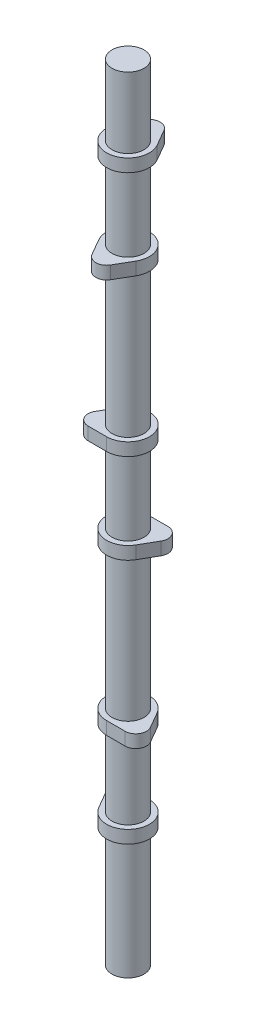
ISO-10303-21;
HEADER;
FILE_DESCRIPTION(('STEP AP214'),'2;1');
FILE_NAME('part.step','',(''),(''),'','','');
FILE_SCHEMA(('AUTOMOTIVE_DESIGN { 1 0 10303 214 1 1 1 1 }'));
ENDSEC;
DATA;
#1=APPLICATION_CONTEXT('core data for automotive mechanical design processes');
#2=APPLICATION_PROTOCOL_DEFINITION('international standard','automotive_design',2000,#1);
#3=PRODUCT_CONTEXT('',#1,'mechanical');
#4=PRODUCT('Part','Part','',(#3));
#5=PRODUCT_RELATED_PRODUCT_CATEGORY('part','',(#4));
#6=PRODUCT_DEFINITION_FORMATION('','',#4);
#7=PRODUCT_DEFINITION_CONTEXT('part definition',#1,'design');
#8=PRODUCT_DEFINITION('design','',#6,#7);
#9=PRODUCT_DEFINITION_SHAPE('','',#8);
#10=(LENGTH_UNIT() NAMED_UNIT(*) SI_UNIT(.MILLI.,.METRE.));
#11=(NAMED_UNIT(*) PLANE_ANGLE_UNIT() SI_UNIT($,.RADIAN.));
#12=(NAMED_UNIT(*) SI_UNIT($,.STERADIAN.) SOLID_ANGLE_UNIT());
#13=UNCERTAINTY_MEASURE_WITH_UNIT(LENGTH_MEASURE(1.E-05),#10,'distance_accuracy_value','');
#14=(GEOMETRIC_REPRESENTATION_CONTEXT(3) GLOBAL_UNCERTAINTY_ASSIGNED_CONTEXT((#13)) GLOBAL_UNIT_ASSIGNED_CONTEXT((#10,
#11,#12)) REPRESENTATION_CONTEXT('',''));
#15=CARTESIAN_POINT('',(0.,0.,0.));
#16=DIRECTION('',(0.,0.,1.));
#17=DIRECTION('',(1.,0.,0.));
#18=AXIS2_PLACEMENT_3D('',#15,#16,#17);
#19=CARTESIAN_POINT('',(-10.9985226280623,-138.43,6.35000000000005));
#20=DIRECTION('',(0.,-1.,0.));
#21=DIRECTION('',(-0.866025403784436,0.,0.500000000000004));
#22=AXIS2_PLACEMENT_3D('',#19,#20,#21);
#23=CYLINDRICAL_SURFACE('',#22,6.35);
#24=CARTESIAN_POINT('',(-10.9985226280623,-146.05,6.35000000000005));
#25=DIRECTION('',(0.,1.,0.));
#26=DIRECTION('',(0.866025403784436,0.,-0.500000000000004));
#27=AXIS2_PLACEMENT_3D('',#24,#25,#26);
#28=CIRCLE('',#27,6.35);
#29=CARTESIAN_POINT('',(-16.4977839420935,-146.05,3.17500000000008));
#30=VERTEX_POINT('',#29);
#31=CARTESIAN_POINT('',(-10.9985226280623,-146.05,12.7000000000001));
#32=VERTEX_POINT('',#31);
#33=EDGE_CURVE('E327',#30,#32,#28,.T.);
#34=ORIENTED_EDGE('',*,*,#33,.T.);
#35=DIRECTION('',(0.,-1.,0.));
#36=VECTOR('',#35,1.);
#37=CARTESIAN_POINT('',(-10.9985226280623,-138.43,12.7000000000001));
#38=LINE('',#37,#36);
#39=CARTESIAN_POINT('',(-10.9985226280623,-138.43,12.7000000000001));
#40=VERTEX_POINT('',#39);
#41=EDGE_CURVE('E315',#40,#32,#38,.T.);
#42=ORIENTED_EDGE('',*,*,#41,.F.);
#43=CARTESIAN_POINT('',(-10.9985226280623,-138.43,6.35000000000005));
#44=DIRECTION('',(0.,1.,0.));
#45=DIRECTION('',(0.866025403784436,0.,-0.500000000000004));
#46=AXIS2_PLACEMENT_3D('',#43,#44,#45);
#47=CIRCLE('',#46,6.35);
#48=CARTESIAN_POINT('',(-16.4977839420935,-138.43,3.17500000000008));
#49=VERTEX_POINT('',#48);
#50=EDGE_CURVE('E316',#49,#40,#47,.T.);
#51=ORIENTED_EDGE('',*,*,#50,.F.);
#52=DIRECTION('',(0.,-1.,0.));
#53=VECTOR('',#52,1.);
#54=CARTESIAN_POINT('',(-16.4977839420935,-138.43,3.17500000000008));
#55=LINE('',#54,#53);
#56=EDGE_CURVE('E326',#49,#30,#55,.T.);
#57=ORIENTED_EDGE('',*,*,#56,.T.);
#58=EDGE_LOOP('',(#34,#42,#51,#57));
#59=FACE_BOUND('',#58,.T.);
#60=ADVANCED_FACE('F54',(#59),#23,.T.);
#61=CARTESIAN_POINT('',(-10.9985226280623,-138.43,12.7000000000001));
#62=DIRECTION('',(0.,0.,-1.));
#63=DIRECTION('',(-1.,0.,0.));
#64=AXIS2_PLACEMENT_3D('',#61,#62,#63);
#65=PLANE('',#64);
#66=DIRECTION('',(1.,0.,0.));
#67=VECTOR('',#66,1.);
#68=CARTESIAN_POINT('',(-10.9985226280623,-146.05,12.7000000000001));
#69=LINE('',#68,#67);
#70=CARTESIAN_POINT('',(0.,-146.05,12.7));
#71=VERTEX_POINT('',#70);
#72=EDGE_CURVE('E331',#32,#71,#69,.T.);
#73=ORIENTED_EDGE('',*,*,#72,.T.);
#74=DIRECTION('',(0.,-1.,0.));
#75=VECTOR('',#74,1.);
#76=CARTESIAN_POINT('',(0.,-138.43,12.7));
#77=LINE('',#76,#75);
#78=CARTESIAN_POINT('',(0.,-138.43,12.7));
#79=VERTEX_POINT('',#78);
#80=EDGE_CURVE('E343',#79,#71,#77,.T.);
#81=ORIENTED_EDGE('',*,*,#80,.F.);
#82=DIRECTION('',(1.,0.,0.));
#83=VECTOR('',#82,1.);
#84=CARTESIAN_POINT('',(-10.9985226280623,-138.43,12.7000000000001));
#85=LINE('',#84,#83);
#86=EDGE_CURVE('E103',#40,#79,#85,.T.);
#87=ORIENTED_EDGE('',*,*,#86,.F.);
#88=ORIENTED_EDGE('',*,*,#41,.T.);
#89=EDGE_LOOP('',(#73,#81,#87,#88));
#90=FACE_BOUND('',#89,.T.);
#91=ADVANCED_FACE('F415',(#90),#65,.F.);
#92=CARTESIAN_POINT('',(0.,-138.43,0.));
#93=DIRECTION('',(0.,-1.,0.));
#94=DIRECTION('',(-0.866025403784436,0.,0.500000000000004));
#95=AXIS2_PLACEMENT_3D('',#92,#93,#94);
#96=CYLINDRICAL_SURFACE('',#95,12.7);
#97=CARTESIAN_POINT('',(0.,-146.05,0.));
#98=DIRECTION('',(0.,1.,0.));
#99=DIRECTION('',(0.866025403784436,0.,-0.500000000000004));
#100=AXIS2_PLACEMENT_3D('',#97,#98,#99);
#101=CIRCLE('',#100,12.7);
#102=CARTESIAN_POINT('',(-10.9985226280624,-146.05,-6.34999999999995));
#103=VERTEX_POINT('',#102);
#104=EDGE_CURVE('E89',#71,#103,#101,.T.);
#105=ORIENTED_EDGE('',*,*,#104,.T.);
#106=DIRECTION('',(0.,-1.,0.));
#107=VECTOR('',#106,1.);
#108=CARTESIAN_POINT('',(-10.9985226280624,-138.43,-6.34999999999995));
#109=LINE('',#108,#107);
#110=CARTESIAN_POINT('',(-10.9985226280624,-138.43,-6.34999999999995));
#111=VERTEX_POINT('',#110);
#112=EDGE_CURVE('E340',#111,#103,#109,.T.);
#113=ORIENTED_EDGE('',*,*,#112,.F.);
#114=CARTESIAN_POINT('',(0.,-138.43,0.));
#115=DIRECTION('',(0.,1.,0.));
#116=DIRECTION('',(0.866025403784436,0.,-0.500000000000004));
#117=AXIS2_PLACEMENT_3D('',#114,#115,#116);
#118=CIRCLE('',#117,12.7);
#119=EDGE_CURVE('E321',#79,#111,#118,.T.);
#120=ORIENTED_EDGE('',*,*,#119,.F.);
#121=ORIENTED_EDGE('',*,*,#80,.T.);
#122=EDGE_LOOP('',(#105,#113,#120,#121));
#123=FACE_BOUND('',#122,.T.);
#124=ADVANCED_FACE('F420',(#123),#96,.T.);
#125=CARTESIAN_POINT('',(-16.4977839420935,-138.43,3.17500000000008));
#126=DIRECTION('',(0.866025403784441,0.,0.499999999999996));
#127=DIRECTION('',(0.499999999999996,0.,-0.866025403784441));
#128=AXIS2_PLACEMENT_3D('',#125,#126,#127);
#129=PLANE('',#128);
#130=DIRECTION('',(-0.499999999999996,0.,0.866025403784441));
#131=VECTOR('',#130,1.);
#132=CARTESIAN_POINT('',(-16.4977839420935,-146.05,3.17500000000008));
#133=LINE('',#132,#131);
#134=EDGE_CURVE('E95',#103,#30,#133,.T.);
#135=ORIENTED_EDGE('',*,*,#134,.T.);
#136=ORIENTED_EDGE('',*,*,#56,.F.);
#137=DIRECTION('',(-0.499999999999996,0.,0.866025403784441));
#138=VECTOR('',#137,1.);
#139=CARTESIAN_POINT('',(-16.4977839420935,-138.43,3.17500000000008));
#140=LINE('',#139,#138);
#141=EDGE_CURVE('E71',#111,#49,#140,.T.);
#142=ORIENTED_EDGE('',*,*,#141,.F.);
#143=ORIENTED_EDGE('',*,*,#112,.T.);
#144=EDGE_LOOP('',(#135,#136,#142,#143));
#145=FACE_BOUND('',#144,.T.);
#146=ADVANCED_FACE('F429',(#145),#129,.F.);
#147=CARTESIAN_POINT('',(-10.9985226280623,-138.43,6.35000000000005));
#148=DIRECTION('',(0.,1.,0.));
#149=DIRECTION('',(0.866025403784436,0.,-0.500000000000004));
#150=AXIS2_PLACEMENT_3D('',#147,#148,#149);
#151=PLANE('',#150);
#152=CARTESIAN_POINT('',(0.,-138.43,0.));
#153=DIRECTION('',(0.,1.,0.));
#154=DIRECTION('',(0.,0.,1.));
#155=AXIS2_PLACEMENT_3D('',#152,#153,#154);
#156=CIRCLE('',#155,9.5);
#157=CARTESIAN_POINT('',(0.,-138.43,9.5));
#158=VERTEX_POINT('',#157);
#159=EDGE_CURVE('E310',#158,#158,#156,.T.);
#160=ORIENTED_EDGE('',*,*,#159,.F.);
#161=EDGE_LOOP('',(#160));
#162=FACE_BOUND('',#161,.T.);
#163=ORIENTED_EDGE('',*,*,#50,.T.);
#164=ORIENTED_EDGE('',*,*,#86,.T.);
#165=ORIENTED_EDGE('',*,*,#119,.T.);
#166=ORIENTED_EDGE('',*,*,#141,.T.);
#167=EDGE_LOOP('',(#163,#164,#165,#166));
#168=FACE_BOUND('',#167,.T.);
#169=ADVANCED_FACE('F427',(#162,#168),#151,.T.);
#170=CARTESIAN_POINT('',(-10.9985226280623,-146.05,6.35000000000005));
#171=DIRECTION('',(0.,1.,0.));
#172=DIRECTION('',(0.866025403784436,0.,-0.500000000000004));
#173=AXIS2_PLACEMENT_3D('',#170,#171,#172);
#174=PLANE('',#173);
#175=CARTESIAN_POINT('',(0.,-146.05,0.));
#176=DIRECTION('',(0.,1.,0.));
#177=DIRECTION('',(0.,0.,1.));
#178=AXIS2_PLACEMENT_3D('',#175,#176,#177);
#179=CIRCLE('',#178,9.5);
#180=CARTESIAN_POINT('',(0.,-146.05,9.5));
#181=VERTEX_POINT('',#180);
#182=EDGE_CURVE('E305',#181,#181,#179,.T.);
#183=ORIENTED_EDGE('',*,*,#182,.T.);
#184=EDGE_LOOP('',(#183));
#185=FACE_BOUND('',#184,.T.);
#186=ORIENTED_EDGE('',*,*,#33,.F.);
#187=ORIENTED_EDGE('',*,*,#134,.F.);
#188=ORIENTED_EDGE('',*,*,#104,.F.);
#189=ORIENTED_EDGE('',*,*,#72,.F.);
#190=EDGE_LOOP('',(#186,#187,#188,#189));
#191=FACE_BOUND('',#190,.T.);
#192=ADVANCED_FACE('F425',(#185,#191),#174,.F.);
#193=CARTESIAN_POINT('',(0.,-416.56,0.));
#194=DIRECTION('',(0.,1.,0.));
#195=DIRECTION('',(0.,0.,1.));
#196=AXIS2_PLACEMENT_3D('',#193,#194,#195);
#197=CYLINDRICAL_SURFACE('',#196,9.5);
#198=CARTESIAN_POINT('',(0.,-191.77,0.));
#199=DIRECTION('',(0.,1.,0.));
#200=DIRECTION('',(0.,0.,1.));
#201=AXIS2_PLACEMENT_3D('',#198,#199,#200);
#202=CIRCLE('',#201,9.5);
#203=CARTESIAN_POINT('',(0.,-191.77,9.5));
#204=VERTEX_POINT('',#203);
#205=EDGE_CURVE('E314',#204,#204,#202,.F.);
#206=ORIENTED_EDGE('',*,*,#205,.F.);
#207=EDGE_LOOP('',(#206));
#208=FACE_BOUND('',#207,.T.);
#209=ORIENTED_EDGE('',*,*,#182,.F.);
#210=EDGE_LOOP('',(#209));
#211=FACE_BOUND('',#210,.T.);
#212=ADVANCED_FACE('F436',(#208,#211),#197,.T.);
#213=ORIENTED_EDGE('',*,*,#159,.T.);
#214=EDGE_LOOP('',(#213));
#215=FACE_BOUND('',#214,.T.);
#216=CARTESIAN_POINT('',(0.,49.53,0.));
#217=DIRECTION('',(0.,1.,0.));
#218=DIRECTION('',(0.,0.,1.));
#219=AXIS2_PLACEMENT_3D('',#216,#217,#218);
#220=CIRCLE('',#219,9.5);
#221=CARTESIAN_POINT('',(0.,49.53,9.5));
#222=VERTEX_POINT('',#221);
#223=EDGE_CURVE('E306',#222,#222,#220,.T.);
#224=ORIENTED_EDGE('',*,*,#223,.F.);
#225=EDGE_LOOP('',(#224));
#226=FACE_BOUND('',#225,.T.);
#227=ADVANCED_FACE('F372',(#215,#226),#197,.T.);
#228=CARTESIAN_POINT('',(0.,49.53,0.));
#229=DIRECTION('',(0.,1.,0.));
#230=DIRECTION('',(0.,0.,1.));
#231=AXIS2_PLACEMENT_3D('',#228,#229,#230);
#232=PLANE('',#231);
#233=ORIENTED_EDGE('',*,*,#223,.T.);
#234=EDGE_LOOP('',(#233));
#235=FACE_BOUND('',#234,.T.);
#236=ADVANCED_FACE('F483',(#235),#232,.T.);
#237=CARTESIAN_POINT('',(10.9985226280624,-191.77,-6.34999999999997));
#238=DIRECTION('',(0.,-1.,0.));
#239=DIRECTION('',(0.86602540378444,0.,-0.499999999999998));
#240=AXIS2_PLACEMENT_3D('',#237,#238,#239);
#241=CYLINDRICAL_SURFACE('',#240,6.35);
#242=CARTESIAN_POINT('',(10.9985226280624,-199.39,-6.34999999999997));
#243=DIRECTION('',(0.,1.,0.));
#244=DIRECTION('',(-0.86602540378444,0.,0.499999999999998));
#245=AXIS2_PLACEMENT_3D('',#242,#243,#244);
#246=CIRCLE('',#245,6.35);
#247=CARTESIAN_POINT('',(16.4977839420936,-199.39,-3.17499999999996));
#248=VERTEX_POINT('',#247);
#249=CARTESIAN_POINT('',(10.9985226280624,-199.39,-12.7));
#250=VERTEX_POINT('',#249);
#251=EDGE_CURVE('E273',#248,#250,#246,.T.);
#252=ORIENTED_EDGE('',*,*,#251,.T.);
#253=DIRECTION('',(0.,-1.,0.));
#254=VECTOR('',#253,1.);
#255=CARTESIAN_POINT('',(10.9985226280624,-191.77,-12.7));
#256=LINE('',#255,#254);
#257=CARTESIAN_POINT('',(10.9985226280624,-191.77,-12.7));
#258=VERTEX_POINT('',#257);
#259=EDGE_CURVE('E296',#258,#250,#256,.T.);
#260=ORIENTED_EDGE('',*,*,#259,.F.);
#261=CARTESIAN_POINT('',(10.9985226280624,-191.77,-6.34999999999997));
#262=DIRECTION('',(0.,1.,0.));
#263=DIRECTION('',(-0.86602540378444,0.,0.499999999999998));
#264=AXIS2_PLACEMENT_3D('',#261,#262,#263);
#265=CIRCLE('',#264,6.35);
#266=CARTESIAN_POINT('',(16.4977839420936,-191.77,-3.17499999999996));
#267=VERTEX_POINT('',#266);
#268=EDGE_CURVE('E258',#267,#258,#265,.T.);
#269=ORIENTED_EDGE('',*,*,#268,.F.);
#270=DIRECTION('',(0.,-1.,0.));
#271=VECTOR('',#270,1.);
#272=CARTESIAN_POINT('',(16.4977839420936,-191.77,-3.17499999999996));
#273=LINE('',#272,#271);
#274=EDGE_CURVE('E272',#267,#248,#273,.T.);
#275=ORIENTED_EDGE('',*,*,#274,.T.);
#276=EDGE_LOOP('',(#252,#260,#269,#275));
#277=FACE_BOUND('',#276,.T.);
#278=ADVANCED_FACE('F493',(#277),#241,.T.);
#279=CARTESIAN_POINT('',(10.9985226280624,-191.77,-12.7));
#280=DIRECTION('',(0.,0.,1.));
#281=DIRECTION('',(1.,0.,0.));
#282=AXIS2_PLACEMENT_3D('',#279,#280,#281);
#283=PLANE('',#282);
#284=DIRECTION('',(-1.,0.,0.));
#285=VECTOR('',#284,1.);
#286=CARTESIAN_POINT('',(10.9985226280624,-199.39,-12.7));
#287=LINE('',#286,#285);
#288=CARTESIAN_POINT('',(0.,-199.39,-12.7));
#289=VERTEX_POINT('',#288);
#290=EDGE_CURVE('E277',#250,#289,#287,.T.);
#291=ORIENTED_EDGE('',*,*,#290,.T.);
#292=DIRECTION('',(0.,-1.,0.));
#293=VECTOR('',#292,1.);
#294=CARTESIAN_POINT('',(0.,-191.77,-12.7));
#295=LINE('',#294,#293);
#296=CARTESIAN_POINT('',(0.,-191.77,-12.7));
#297=VERTEX_POINT('',#296);
#298=EDGE_CURVE('E292',#297,#289,#295,.T.);
#299=ORIENTED_EDGE('',*,*,#298,.F.);
#300=DIRECTION('',(-1.,0.,0.));
#301=VECTOR('',#300,1.);
#302=CARTESIAN_POINT('',(10.9985226280624,-191.77,-12.7));
#303=LINE('',#302,#301);
#304=EDGE_CURVE('E262',#258,#297,#303,.T.);
#305=ORIENTED_EDGE('',*,*,#304,.F.);
#306=ORIENTED_EDGE('',*,*,#259,.T.);
#307=EDGE_LOOP('',(#291,#299,#305,#306));
#308=FACE_BOUND('',#307,.T.);
#309=ADVANCED_FACE('F504',(#308),#283,.F.);
#310=CARTESIAN_POINT('',(0.,-191.77,0.));
#311=DIRECTION('',(0.,-1.,0.));
#312=DIRECTION('',(0.86602540378444,0.,-0.499999999999998));
#313=AXIS2_PLACEMENT_3D('',#310,#311,#312);
#314=CYLINDRICAL_SURFACE('',#313,12.7);
#315=CARTESIAN_POINT('',(0.,-199.39,0.));
#316=DIRECTION('',(0.,1.,0.));
#317=DIRECTION('',(-0.86602540378444,0.,0.499999999999998));
#318=AXIS2_PLACEMENT_3D('',#315,#316,#317);
#319=CIRCLE('',#318,12.7);
#320=CARTESIAN_POINT('',(10.9985226280624,-199.39,6.35000000000003));
#321=VERTEX_POINT('',#320);
#322=EDGE_CURVE('E280',#289,#321,#319,.T.);
#323=ORIENTED_EDGE('',*,*,#322,.T.);
#324=DIRECTION('',(0.,-1.,0.));
#325=VECTOR('',#324,1.);
#326=CARTESIAN_POINT('',(10.9985226280624,-191.77,6.35000000000003));
#327=LINE('',#326,#325);
#328=CARTESIAN_POINT('',(10.9985226280624,-191.77,6.35000000000003));
#329=VERTEX_POINT('',#328);
#330=EDGE_CURVE('E288',#329,#321,#327,.T.);
#331=ORIENTED_EDGE('',*,*,#330,.F.);
#332=CARTESIAN_POINT('',(0.,-191.77,0.));
#333=DIRECTION('',(0.,1.,0.));
#334=DIRECTION('',(-0.86602540378444,0.,0.499999999999998));
#335=AXIS2_PLACEMENT_3D('',#332,#333,#334);
#336=CIRCLE('',#335,12.7);
#337=EDGE_CURVE('E266',#297,#329,#336,.T.);
#338=ORIENTED_EDGE('',*,*,#337,.F.);
#339=ORIENTED_EDGE('',*,*,#298,.T.);
#340=EDGE_LOOP('',(#323,#331,#338,#339));
#341=FACE_BOUND('',#340,.T.);
#342=ADVANCED_FACE('F514',(#341),#314,.T.);
#343=CARTESIAN_POINT('',(16.4977839420936,-191.77,-3.17499999999996));
#344=DIRECTION('',(-0.866025403784438,0.,-0.500000000000002));
#345=DIRECTION('',(-0.500000000000002,0.,0.866025403784438));
#346=AXIS2_PLACEMENT_3D('',#343,#344,#345);
#347=PLANE('',#346);
#348=DIRECTION('',(0.500000000000002,0.,-0.866025403784438));
#349=VECTOR('',#348,1.);
#350=CARTESIAN_POINT('',(16.4977839420936,-199.39,-3.17499999999996));
#351=LINE('',#350,#349);
#352=EDGE_CURVE('E263',#321,#248,#351,.T.);
#353=ORIENTED_EDGE('',*,*,#352,.T.);
#354=ORIENTED_EDGE('',*,*,#274,.F.);
#355=DIRECTION('',(0.500000000000002,0.,-0.866025403784438));
#356=VECTOR('',#355,1.);
#357=CARTESIAN_POINT('',(16.4977839420936,-191.77,-3.17499999999996));
#358=LINE('',#357,#356);
#359=EDGE_CURVE('E269',#329,#267,#358,.T.);
#360=ORIENTED_EDGE('',*,*,#359,.F.);
#361=ORIENTED_EDGE('',*,*,#330,.T.);
#362=EDGE_LOOP('',(#353,#354,#360,#361));
#363=FACE_BOUND('',#362,.T.);
#364=ADVANCED_FACE('F525',(#363),#347,.F.);
#365=CARTESIAN_POINT('',(10.9985226280624,-191.77,-6.34999999999997));
#366=DIRECTION('',(0.,1.,0.));
#367=DIRECTION('',(-0.86602540378444,0.,0.499999999999998));
#368=AXIS2_PLACEMENT_3D('',#365,#366,#367);
#369=PLANE('',#368);
#370=ORIENTED_EDGE('',*,*,#205,.T.);
#371=EDGE_LOOP('',(#370));
#372=FACE_BOUND('',#371,.T.);
#373=ORIENTED_EDGE('',*,*,#268,.T.);
#374=ORIENTED_EDGE('',*,*,#304,.T.);
#375=ORIENTED_EDGE('',*,*,#337,.T.);
#376=ORIENTED_EDGE('',*,*,#359,.T.);
#377=EDGE_LOOP('',(#373,#374,#375,#376));
#378=FACE_BOUND('',#377,.T.);
#379=ADVANCED_FACE('F536',(#372,#378),#369,.T.);
#380=CARTESIAN_POINT('',(10.9985226280624,-199.39,-6.34999999999997));
#381=DIRECTION('',(0.,1.,0.));
#382=DIRECTION('',(-0.86602540378444,0.,0.499999999999998));
#383=AXIS2_PLACEMENT_3D('',#380,#381,#382);
#384=PLANE('',#383);
#385=CARTESIAN_POINT('',(0.,-199.39,0.));
#386=DIRECTION('',(0.,1.,0.));
#387=DIRECTION('',(0.,0.,1.));
#388=AXIS2_PLACEMENT_3D('',#385,#386,#387);
#389=CIRCLE('',#388,9.5);
#390=CARTESIAN_POINT('',(0.,-199.39,9.5));
#391=VERTEX_POINT('',#390);
#392=EDGE_CURVE('E300',#391,#391,#389,.F.);
#393=ORIENTED_EDGE('',*,*,#392,.F.);
#394=EDGE_LOOP('',(#393));
#395=FACE_BOUND('',#394,.T.);
#396=ORIENTED_EDGE('',*,*,#251,.F.);
#397=ORIENTED_EDGE('',*,*,#352,.F.);
#398=ORIENTED_EDGE('',*,*,#322,.F.);
#399=ORIENTED_EDGE('',*,*,#290,.F.);
#400=EDGE_LOOP('',(#396,#397,#398,#399));
#401=FACE_BOUND('',#400,.T.);
#402=ADVANCED_FACE('F547',(#395,#401),#384,.F.);
#403=CARTESIAN_POINT('',(0.,-284.48,0.));
#404=DIRECTION('',(0.,1.,0.));
#405=DIRECTION('',(0.,0.,1.));
#406=AXIS2_PLACEMENT_3D('',#403,#404,#405);
#407=CIRCLE('',#406,9.5);
#408=CARTESIAN_POINT('',(0.,-284.48,9.5));
#409=VERTEX_POINT('',#408);
#410=EDGE_CURVE('E12',#409,#409,#407,.F.);
#411=ORIENTED_EDGE('',*,*,#410,.F.);
#412=EDGE_LOOP('',(#411));
#413=FACE_BOUND('',#412,.T.);
#414=ORIENTED_EDGE('',*,*,#392,.T.);
#415=EDGE_LOOP('',(#414));
#416=FACE_BOUND('',#415,.T.);
#417=ADVANCED_FACE('F473',(#413,#416),#197,.T.);
#418=CARTESIAN_POINT('',(10.9985226280624,-284.48,6.3499999999999));
#419=DIRECTION('',(0.,-1.,0.));
#420=DIRECTION('',(0.866025403784443,0.,0.499999999999992));
#421=AXIS2_PLACEMENT_3D('',#418,#419,#420);
#422=CYLINDRICAL_SURFACE('',#421,6.35);
#423=CARTESIAN_POINT('',(10.9985226280624,-292.1,6.3499999999999));
#424=DIRECTION('',(0.,1.,0.));
#425=DIRECTION('',(-0.866025403784443,0.,-0.499999999999992));
#426=AXIS2_PLACEMENT_3D('',#423,#424,#425);
#427=CIRCLE('',#426,6.35);
#428=CARTESIAN_POINT('',(10.9985226280625,-292.1,12.6999999999999));
#429=VERTEX_POINT('',#428);
#430=CARTESIAN_POINT('',(16.4977839420936,-292.1,3.17499999999985));
#431=VERTEX_POINT('',#430);
#432=EDGE_CURVE('E204',#429,#431,#427,.T.);
#433=ORIENTED_EDGE('',*,*,#432,.T.);
#434=DIRECTION('',(0.,-1.,0.));
#435=VECTOR('',#434,1.);
#436=CARTESIAN_POINT('',(16.4977839420936,-284.48,3.17499999999985));
#437=LINE('',#436,#435);
#438=CARTESIAN_POINT('',(16.4977839420936,-284.48,3.17499999999985));
#439=VERTEX_POINT('',#438);
#440=EDGE_CURVE('E182',#439,#431,#437,.T.);
#441=ORIENTED_EDGE('',*,*,#440,.F.);
#442=CARTESIAN_POINT('',(10.9985226280624,-284.48,6.3499999999999));
#443=DIRECTION('',(0.,1.,0.));
#444=DIRECTION('',(-0.866025403784443,0.,-0.499999999999992));
#445=AXIS2_PLACEMENT_3D('',#442,#443,#444);
#446=CIRCLE('',#445,6.35);
#447=CARTESIAN_POINT('',(10.9985226280625,-284.48,12.6999999999999));
#448=VERTEX_POINT('',#447);
#449=EDGE_CURVE('E190',#448,#439,#446,.T.);
#450=ORIENTED_EDGE('',*,*,#449,.F.);
#451=DIRECTION('',(0.,-1.,0.));
#452=VECTOR('',#451,1.);
#453=CARTESIAN_POINT('',(10.9985226280625,-284.48,12.6999999999999));
#454=LINE('',#453,#452);
#455=EDGE_CURVE('E395',#448,#429,#454,.T.);
#456=ORIENTED_EDGE('',*,*,#455,.T.);
#457=EDGE_LOOP('',(#433,#441,#450,#456));
#458=FACE_BOUND('',#457,.T.);
#459=ADVANCED_FACE('F202',(#458),#422,.T.);
#460=CARTESIAN_POINT('',(16.4977839420936,-284.48,3.17499999999985));
#461=DIRECTION('',(-0.866025403784434,0.,0.500000000000008));
#462=DIRECTION('',(0.500000000000008,0.,0.866025403784434));
#463=AXIS2_PLACEMENT_3D('',#460,#461,#462);
#464=PLANE('',#463);
#465=DIRECTION('',(-0.500000000000008,0.,-0.866025403784434));
#466=VECTOR('',#465,1.);
#467=CARTESIAN_POINT('',(16.4977839420936,-292.1,3.17499999999985));
#468=LINE('',#467,#466);
#469=CARTESIAN_POINT('',(10.9985226280623,-292.1,-6.35000000000011));
#470=VERTEX_POINT('',#469);
#471=EDGE_CURVE('E382',#431,#470,#468,.T.);
#472=ORIENTED_EDGE('',*,*,#471,.T.);
#473=DIRECTION('',(0.,-1.,0.));
#474=VECTOR('',#473,1.);
#475=CARTESIAN_POINT('',(10.9985226280623,-284.48,-6.35000000000011));
#476=LINE('',#475,#474);
#477=CARTESIAN_POINT('',(10.9985226280623,-284.48,-6.35000000000011));
#478=VERTEX_POINT('',#477);
#479=EDGE_CURVE('E185',#478,#470,#476,.T.);
#480=ORIENTED_EDGE('',*,*,#479,.F.);
#481=DIRECTION('',(-0.500000000000008,0.,-0.866025403784434));
#482=VECTOR('',#481,1.);
#483=CARTESIAN_POINT('',(16.4977839420936,-284.48,3.17499999999985));
#484=LINE('',#483,#482);
#485=EDGE_CURVE('E178',#439,#478,#484,.T.);
#486=ORIENTED_EDGE('',*,*,#485,.F.);
#487=ORIENTED_EDGE('',*,*,#440,.T.);
#488=EDGE_LOOP('',(#472,#480,#486,#487));
#489=FACE_BOUND('',#488,.T.);
#490=ADVANCED_FACE('F180',(#489),#464,.F.);
#491=CARTESIAN_POINT('',(0.,-284.48,0.));
#492=DIRECTION('',(0.,-1.,0.));
#493=DIRECTION('',(0.866025403784443,0.,0.499999999999992));
#494=AXIS2_PLACEMENT_3D('',#491,#492,#493);
#495=CYLINDRICAL_SURFACE('',#494,12.7);
#496=CARTESIAN_POINT('',(0.,-292.1,0.));
#497=DIRECTION('',(0.,1.,0.));
#498=DIRECTION('',(-0.866025403784443,0.,-0.499999999999992));
#499=AXIS2_PLACEMENT_3D('',#496,#497,#498);
#500=CIRCLE('',#499,12.7);
#501=CARTESIAN_POINT('',(1.196959198424E-13,-292.1,12.7));
#502=VERTEX_POINT('',#501);
#503=EDGE_CURVE('E386',#470,#502,#500,.T.);
#504=ORIENTED_EDGE('',*,*,#503,.T.);
#505=DIRECTION('',(0.,-1.,0.));
#506=VECTOR('',#505,1.);
#507=CARTESIAN_POINT('',(1.196959198424E-13,-284.48,12.7));
#508=LINE('',#507,#506);
#509=CARTESIAN_POINT('',(1.196959198424E-13,-284.48,12.7));
#510=VERTEX_POINT('',#509);
#511=EDGE_CURVE('E212',#510,#502,#508,.T.);
#512=ORIENTED_EDGE('',*,*,#511,.F.);
#513=CARTESIAN_POINT('',(0.,-284.48,0.));
#514=DIRECTION('',(0.,1.,0.));
#515=DIRECTION('',(-0.866025403784443,0.,-0.499999999999992));
#516=AXIS2_PLACEMENT_3D('',#513,#514,#515);
#517=CIRCLE('',#516,12.7);
#518=EDGE_CURVE('E189',#478,#510,#517,.T.);
#519=ORIENTED_EDGE('',*,*,#518,.F.);
#520=ORIENTED_EDGE('',*,*,#479,.T.);
#521=EDGE_LOOP('',(#504,#512,#519,#520));
#522=FACE_BOUND('',#521,.T.);
#523=ADVANCED_FACE('F403',(#522),#495,.T.);
#524=CARTESIAN_POINT('',(10.9985226280625,-284.48,12.6999999999999));
#525=DIRECTION('',(0.,0.,-1.));
#526=DIRECTION('',(-1.,0.,0.));
#527=AXIS2_PLACEMENT_3D('',#524,#525,#526);
#528=PLANE('',#527);
#529=DIRECTION('',(1.,0.,0.));
#530=VECTOR('',#529,1.);
#531=CARTESIAN_POINT('',(10.9985226280625,-292.1,12.6999999999999));
#532=LINE('',#531,#530);
#533=EDGE_CURVE('E200',#502,#429,#532,.T.);
#534=ORIENTED_EDGE('',*,*,#533,.T.);
#535=ORIENTED_EDGE('',*,*,#455,.F.);
#536=DIRECTION('',(1.,0.,0.));
#537=VECTOR('',#536,1.);
#538=CARTESIAN_POINT('',(10.9985226280625,-284.48,12.6999999999999));
#539=LINE('',#538,#537);
#540=EDGE_CURVE('E195',#510,#448,#539,.T.);
#541=ORIENTED_EDGE('',*,*,#540,.F.);
#542=ORIENTED_EDGE('',*,*,#511,.T.);
#543=EDGE_LOOP('',(#534,#535,#541,#542));
#544=FACE_BOUND('',#543,.T.);
#545=ADVANCED_FACE('F401',(#544),#528,.F.);
#546=CARTESIAN_POINT('',(10.9985226280624,-284.48,6.3499999999999));
#547=DIRECTION('',(0.,1.,0.));
#548=DIRECTION('',(-0.866025403784443,0.,-0.499999999999992));
#549=AXIS2_PLACEMENT_3D('',#546,#547,#548);
#550=PLANE('',#549);
#551=ORIENTED_EDGE('',*,*,#410,.T.);
#552=EDGE_LOOP('',(#551));
#553=FACE_BOUND('',#552,.T.);
#554=ORIENTED_EDGE('',*,*,#449,.T.);
#555=ORIENTED_EDGE('',*,*,#485,.T.);
#556=ORIENTED_EDGE('',*,*,#518,.T.);
#557=ORIENTED_EDGE('',*,*,#540,.T.);
#558=EDGE_LOOP('',(#554,#555,#556,#557));
#559=FACE_BOUND('',#558,.T.);
#560=ADVANCED_FACE('F193',(#553,#559),#550,.T.);
#561=CARTESIAN_POINT('',(10.9985226280624,-292.1,6.3499999999999));
#562=DIRECTION('',(0.,1.,0.));
#563=DIRECTION('',(-0.866025403784443,0.,-0.499999999999992));
#564=AXIS2_PLACEMENT_3D('',#561,#562,#563);
#565=PLANE('',#564);
#566=CARTESIAN_POINT('',(0.,-292.1,0.));
#567=DIRECTION('',(0.,1.,0.));
#568=DIRECTION('',(0.,0.,1.));
#569=AXIS2_PLACEMENT_3D('',#566,#567,#568);
#570=CIRCLE('',#569,9.5);
#571=CARTESIAN_POINT('',(0.,-292.1,9.5));
#572=VERTEX_POINT('',#571);
#573=EDGE_CURVE('E206',#572,#572,#570,.F.);
#574=ORIENTED_EDGE('',*,*,#573,.F.);
#575=EDGE_LOOP('',(#574));
#576=FACE_BOUND('',#575,.T.);
#577=ORIENTED_EDGE('',*,*,#432,.F.);
#578=ORIENTED_EDGE('',*,*,#533,.F.);
#579=ORIENTED_EDGE('',*,*,#503,.F.);
#580=ORIENTED_EDGE('',*,*,#471,.F.);
#581=EDGE_LOOP('',(#577,#578,#579,#580));
#582=FACE_BOUND('',#581,.T.);
#583=ADVANCED_FACE('F375',(#576,#582),#565,.F.);
#584=CARTESIAN_POINT('',(0.,-416.56,0.));
#585=DIRECTION('',(0.,1.,0.));
#586=DIRECTION('',(0.,0.,1.));
#587=AXIS2_PLACEMENT_3D('',#584,#585,#586);
#588=PLANE('',#587);
#589=CARTESIAN_POINT('',(0.,-416.56,0.));
#590=DIRECTION('',(0.,1.,0.));
#591=DIRECTION('',(0.,0.,1.));
#592=AXIS2_PLACEMENT_3D('',#589,#590,#591);
#593=CIRCLE('',#592,9.5);
#594=CARTESIAN_POINT('',(0.,-416.56,9.5));
#595=VERTEX_POINT('',#594);
#596=EDGE_CURVE('E301',#595,#595,#593,.T.);
#597=ORIENTED_EDGE('',*,*,#596,.F.);
#598=EDGE_LOOP('',(#597));
#599=FACE_BOUND('',#598,.T.);
#600=ADVANCED_FACE('F378',(#599),#588,.F.);
#601=ORIENTED_EDGE('',*,*,#596,.T.);
#602=EDGE_LOOP('',(#601));
#603=FACE_BOUND('',#602,.T.);
#604=CARTESIAN_POINT('',(0.,-345.44,0.));
#605=DIRECTION('',(0.,1.,0.));
#606=DIRECTION('',(0.,0.,1.));
#607=AXIS2_PLACEMENT_3D('',#604,#605,#606);
#608=CIRCLE('',#607,9.5);
#609=CARTESIAN_POINT('',(0.,-345.44,9.5));
#610=VERTEX_POINT('',#609);
#611=EDGE_CURVE('E257',#610,#610,#608,.F.);
#612=ORIENTED_EDGE('',*,*,#611,.T.);
#613=EDGE_LOOP('',(#612));
#614=FACE_BOUND('',#613,.T.);
#615=ADVANCED_FACE('F371',(#603,#614),#197,.T.);
#616=CARTESIAN_POINT('',(-10.9985226280624,-345.44,-6.34999999999997));
#617=DIRECTION('',(0.,1.,0.));
#618=DIRECTION('',(0.86602540378444,0.,0.499999999999998));
#619=AXIS2_PLACEMENT_3D('',#616,#617,#618);
#620=PLANE('',#619);
#621=ORIENTED_EDGE('',*,*,#611,.F.);
#622=EDGE_LOOP('',(#621));
#623=FACE_BOUND('',#622,.T.);
#624=CARTESIAN_POINT('',(-10.9985226280624,-345.44,-6.34999999999997));
#625=DIRECTION('',(0.,1.,0.));
#626=DIRECTION('',(0.86602540378444,0.,0.499999999999998));
#627=AXIS2_PLACEMENT_3D('',#624,#625,#626);
#628=CIRCLE('',#627,6.35);
#629=CARTESIAN_POINT('',(-10.9985226280624,-345.44,-12.7));
#630=VERTEX_POINT('',#629);
#631=CARTESIAN_POINT('',(-16.4977839420936,-345.44,-3.17499999999996));
#632=VERTEX_POINT('',#631);
#633=EDGE_CURVE('E211',#630,#632,#628,.T.);
#634=ORIENTED_EDGE('',*,*,#633,.F.);
#635=DIRECTION('',(-1.,0.,0.));
#636=VECTOR('',#635,1.);
#637=CARTESIAN_POINT('',(-10.9985226280624,-345.44,-12.7));
#638=LINE('',#637,#636);
#639=CARTESIAN_POINT('',(0.,-345.44,-12.7));
#640=VERTEX_POINT('',#639);
#641=EDGE_CURVE('E221',#640,#630,#638,.T.);
#642=ORIENTED_EDGE('',*,*,#641,.F.);
#643=CARTESIAN_POINT('',(0.,-345.44,0.));
#644=DIRECTION('',(0.,1.,0.));
#645=DIRECTION('',(0.86602540378444,0.,0.499999999999998));
#646=AXIS2_PLACEMENT_3D('',#643,#644,#645);
#647=CIRCLE('',#646,12.7);
#648=CARTESIAN_POINT('',(-10.9985226280624,-345.44,6.35000000000003));
#649=VERTEX_POINT('',#648);
#650=EDGE_CURVE('E237',#649,#640,#647,.T.);
#651=ORIENTED_EDGE('',*,*,#650,.F.);
#652=DIRECTION('',(0.500000000000002,0.,0.866025403784437));
#653=VECTOR('',#652,1.);
#654=CARTESIAN_POINT('',(-16.4977839420936,-345.44,-3.17499999999996));
#655=LINE('',#654,#653);
#656=EDGE_CURVE('E234',#632,#649,#655,.T.);
#657=ORIENTED_EDGE('',*,*,#656,.F.);
#658=EDGE_LOOP('',(#634,#642,#651,#657));
#659=FACE_BOUND('',#658,.T.);
#660=ADVANCED_FACE('F632',(#623,#659),#620,.F.);
#661=CARTESIAN_POINT('',(-10.9985226280624,-337.82,-12.7));
#662=DIRECTION('',(0.,0.,1.));
#663=DIRECTION('',(1.,0.,0.));
#664=AXIS2_PLACEMENT_3D('',#661,#662,#663);
#665=PLANE('',#664);
#666=ORIENTED_EDGE('',*,*,#641,.T.);
#667=DIRECTION('',(0.,-1.,0.));
#668=VECTOR('',#667,1.);
#669=CARTESIAN_POINT('',(-10.9985226280624,-337.82,-12.7));
#670=LINE('',#669,#668);
#671=CARTESIAN_POINT('',(-10.9985226280624,-337.82,-12.7));
#672=VERTEX_POINT('',#671);
#673=EDGE_CURVE('E230',#672,#630,#670,.T.);
#674=ORIENTED_EDGE('',*,*,#673,.F.);
#675=DIRECTION('',(-1.,0.,0.));
#676=VECTOR('',#675,1.);
#677=CARTESIAN_POINT('',(-10.9985226280624,-337.82,-12.7));
#678=LINE('',#677,#676);
#679=CARTESIAN_POINT('',(0.,-337.82,-12.7));
#680=VERTEX_POINT('',#679);
#681=EDGE_CURVE('E227',#680,#672,#678,.T.);
#682=ORIENTED_EDGE('',*,*,#681,.F.);
#683=DIRECTION('',(0.,-1.,0.));
#684=VECTOR('',#683,1.);
#685=CARTESIAN_POINT('',(0.,-337.82,-12.7));
#686=LINE('',#685,#684);
#687=EDGE_CURVE('E245',#680,#640,#686,.T.);
#688=ORIENTED_EDGE('',*,*,#687,.T.);
#689=EDGE_LOOP('',(#666,#674,#682,#688));
#690=FACE_BOUND('',#689,.T.);
#691=ADVANCED_FACE('F642',(#690),#665,.F.);
#692=CARTESIAN_POINT('',(0.,-337.82,0.));
#693=DIRECTION('',(0.,-1.,0.));
#694=DIRECTION('',(-0.86602540378444,0.,-0.499999999999998));
#695=AXIS2_PLACEMENT_3D('',#692,#693,#694);
#696=CYLINDRICAL_SURFACE('',#695,12.7);
#697=ORIENTED_EDGE('',*,*,#650,.T.);
#698=ORIENTED_EDGE('',*,*,#687,.F.);
#699=CARTESIAN_POINT('',(0.,-337.82,0.));
#700=DIRECTION('',(0.,1.,0.));
#701=DIRECTION('',(0.86602540378444,0.,0.499999999999998));
#702=AXIS2_PLACEMENT_3D('',#699,#700,#701);
#703=CIRCLE('',#702,12.7);
#704=CARTESIAN_POINT('',(-10.9985226280624,-337.82,6.35000000000003));
#705=VERTEX_POINT('',#704);
#706=EDGE_CURVE('E224',#705,#680,#703,.T.);
#707=ORIENTED_EDGE('',*,*,#706,.F.);
#708=DIRECTION('',(0.,-1.,0.));
#709=VECTOR('',#708,1.);
#710=CARTESIAN_POINT('',(-10.9985226280624,-337.82,6.35000000000003));
#711=LINE('',#710,#709);
#712=EDGE_CURVE('E249',#705,#649,#711,.T.);
#713=ORIENTED_EDGE('',*,*,#712,.T.);
#714=EDGE_LOOP('',(#697,#698,#707,#713));
#715=FACE_BOUND('',#714,.T.);
#716=ADVANCED_FACE('F654',(#715),#696,.T.);
#717=CARTESIAN_POINT('',(-16.4977839420936,-337.82,-3.17499999999996));
#718=DIRECTION('',(0.866025403784437,0.,-0.500000000000002));
#719=DIRECTION('',(-0.500000000000002,0.,-0.866025403784437));
#720=AXIS2_PLACEMENT_3D('',#717,#718,#719);
#721=PLANE('',#720);
#722=ORIENTED_EDGE('',*,*,#656,.T.);
#723=ORIENTED_EDGE('',*,*,#712,.F.);
#724=DIRECTION('',(0.500000000000002,0.,0.866025403784437));
#725=VECTOR('',#724,1.);
#726=CARTESIAN_POINT('',(-16.4977839420936,-337.82,-3.17499999999996));
#727=LINE('',#726,#725);
#728=CARTESIAN_POINT('',(-16.4977839420936,-337.82,-3.17499999999996));
#729=VERTEX_POINT('',#728);
#730=EDGE_CURVE('E220',#729,#705,#727,.T.);
#731=ORIENTED_EDGE('',*,*,#730,.F.);
#732=DIRECTION('',(0.,-1.,0.));
#733=VECTOR('',#732,1.);
#734=CARTESIAN_POINT('',(-16.4977839420936,-337.82,-3.17499999999996));
#735=LINE('',#734,#733);
#736=EDGE_CURVE('E253',#729,#632,#735,.T.);
#737=ORIENTED_EDGE('',*,*,#736,.T.);
#738=EDGE_LOOP('',(#722,#723,#731,#737));
#739=FACE_BOUND('',#738,.T.);
#740=ADVANCED_FACE('F665',(#739),#721,.F.);
#741=CARTESIAN_POINT('',(-10.9985226280624,-337.82,-6.34999999999997));
#742=DIRECTION('',(0.,-1.,0.));
#743=DIRECTION('',(-0.86602540378444,0.,-0.499999999999998));
#744=AXIS2_PLACEMENT_3D('',#741,#742,#743);
#745=CYLINDRICAL_SURFACE('',#744,6.35);
#746=ORIENTED_EDGE('',*,*,#633,.T.);
#747=ORIENTED_EDGE('',*,*,#736,.F.);
#748=CARTESIAN_POINT('',(-10.9985226280624,-337.82,-6.34999999999997));
#749=DIRECTION('',(0.,1.,0.));
#750=DIRECTION('',(0.86602540378444,0.,0.499999999999998));
#751=AXIS2_PLACEMENT_3D('',#748,#749,#750);
#752=CIRCLE('',#751,6.35);
#753=EDGE_CURVE('E216',#672,#729,#752,.T.);
#754=ORIENTED_EDGE('',*,*,#753,.F.);
#755=ORIENTED_EDGE('',*,*,#673,.T.);
#756=EDGE_LOOP('',(#746,#747,#754,#755));
#757=FACE_BOUND('',#756,.T.);
#758=ADVANCED_FACE('F676',(#757),#745,.T.);
#759=CARTESIAN_POINT('',(-10.9985226280624,-337.82,-6.34999999999997));
#760=DIRECTION('',(0.,1.,0.));
#761=DIRECTION('',(0.86602540378444,0.,0.499999999999998));
#762=AXIS2_PLACEMENT_3D('',#759,#760,#761);
#763=PLANE('',#762);
#764=CARTESIAN_POINT('',(0.,-337.82,0.));
#765=DIRECTION('',(0.,1.,0.));
#766=DIRECTION('',(0.,0.,1.));
#767=AXIS2_PLACEMENT_3D('',#764,#765,#766);
#768=CIRCLE('',#767,9.5);
#769=CARTESIAN_POINT('',(0.,-337.82,9.5));
#770=VERTEX_POINT('',#769);
#771=EDGE_CURVE('E63',#770,#770,#768,.F.);
#772=ORIENTED_EDGE('',*,*,#771,.T.);
#773=EDGE_LOOP('',(#772));
#774=FACE_BOUND('',#773,.T.);
#775=ORIENTED_EDGE('',*,*,#753,.T.);
#776=ORIENTED_EDGE('',*,*,#730,.T.);
#777=ORIENTED_EDGE('',*,*,#706,.T.);
#778=ORIENTED_EDGE('',*,*,#681,.T.);
#779=EDGE_LOOP('',(#775,#776,#777,#778));
#780=FACE_BOUND('',#779,.T.);
#781=ADVANCED_FACE('F364',(#774,#780),#763,.T.);
#782=ORIENTED_EDGE('',*,*,#771,.F.);
#783=EDGE_LOOP('',(#782));
#784=FACE_BOUND('',#783,.T.);
#785=ORIENTED_EDGE('',*,*,#573,.T.);
#786=EDGE_LOOP('',(#785));
#787=FACE_BOUND('',#786,.T.);
#788=ADVANCED_FACE('F367',(#784,#787),#197,.T.);
#789=CLOSED_SHELL('',(#60,#91,#124,#146,#169,#192,#212,#227,#236,#278,#309,#342,#364,#379,#402,
#417,#459,#490,#523,#545,#560,#583,#600,#615,#660,#691,#716,#740,#758,#781,#788));
#790=MANIFOLD_SOLID_BREP('B2',#789);
#791=CARTESIAN_POINT('',(0.,-45.72,12.7));
#792=DIRECTION('',(0.,-1.,0.));
#793=DIRECTION('',(0.,0.,1.));
#794=AXIS2_PLACEMENT_3D('',#791,#792,#793);
#795=CYLINDRICAL_SURFACE('',#794,6.35);
#796=CARTESIAN_POINT('',(0.,-53.34,12.7));
#797=DIRECTION('',(0.,1.,0.));
#798=DIRECTION('',(0.,0.,-1.));
#799=AXIS2_PLACEMENT_3D('',#796,#797,#798);
#800=CIRCLE('',#799,6.35);
#801=CARTESIAN_POINT('',(-5.49926131403129,-53.34,15.875));
#802=VERTEX_POINT('',#801);
#803=CARTESIAN_POINT('',(5.49926131403107,-53.34,15.875));
#804=VERTEX_POINT('',#803);
#805=EDGE_CURVE('E861',#802,#804,#800,.T.);
#806=ORIENTED_EDGE('',*,*,#805,.T.);
#807=DIRECTION('',(0.,-1.,0.));
#808=VECTOR('',#807,1.);
#809=CARTESIAN_POINT('',(5.49926131403107,-45.72,15.875));
#810=LINE('',#809,#808);
#811=CARTESIAN_POINT('',(5.49926131403107,-45.72,15.875));
#812=VERTEX_POINT('',#811);
#813=EDGE_CURVE('E52',#812,#804,#810,.T.);
#814=ORIENTED_EDGE('',*,*,#813,.F.);
#815=CARTESIAN_POINT('',(0.,-45.72,12.7));
#816=DIRECTION('',(0.,1.,0.));
#817=DIRECTION('',(0.,0.,-1.));
#818=AXIS2_PLACEMENT_3D('',#815,#816,#817);
#819=CIRCLE('',#818,6.35);
#820=CARTESIAN_POINT('',(-5.49926131403129,-45.72,15.875));
#821=VERTEX_POINT('',#820);
#822=EDGE_CURVE('E849',#821,#812,#819,.T.);
#823=ORIENTED_EDGE('',*,*,#822,.F.);
#824=DIRECTION('',(0.,-1.,0.));
#825=VECTOR('',#824,1.);
#826=CARTESIAN_POINT('',(-5.49926131403129,-45.72,15.875));
#827=LINE('',#826,#825);
#828=EDGE_CURVE('E857',#821,#802,#827,.T.);
#829=ORIENTED_EDGE('',*,*,#828,.T.);
#830=EDGE_LOOP('',(#806,#814,#823,#829));
#831=FACE_BOUND('',#830,.T.);
#832=ADVANCED_FACE('F798',(#831),#795,.T.);
#833=CARTESIAN_POINT('',(5.49926131403107,-45.72,15.875));
#834=DIRECTION('',(-0.866025403784435,0.,-0.500000000000006));
#835=DIRECTION('',(-0.500000000000006,0.,0.866025403784435));
#836=AXIS2_PLACEMENT_3D('',#833,#834,#835);
#837=PLANE('',#836);
#838=DIRECTION('',(0.500000000000006,0.,-0.866025403784435));
#839=VECTOR('',#838,1.);
#840=CARTESIAN_POINT('',(5.49926131403107,-53.34,15.875));
#841=LINE('',#840,#839);
#842=CARTESIAN_POINT('',(10.9985226280623,-53.34,6.35000000000007));
#843=VERTEX_POINT('',#842);
#844=EDGE_CURVE('E853',#804,#843,#841,.T.);
#845=ORIENTED_EDGE('',*,*,#844,.T.);
#846=DIRECTION('',(0.,-1.,0.));
#847=VECTOR('',#846,1.);
#848=CARTESIAN_POINT('',(10.9985226280623,-45.72,6.35000000000007));
#849=LINE('',#848,#847);
#850=CARTESIAN_POINT('',(10.9985226280623,-45.72,6.35000000000007));
#851=VERTEX_POINT('',#850);
#852=EDGE_CURVE('E806',#851,#843,#849,.T.);
#853=ORIENTED_EDGE('',*,*,#852,.F.);
#854=DIRECTION('',(0.500000000000006,0.,-0.866025403784435));
#855=VECTOR('',#854,1.);
#856=CARTESIAN_POINT('',(5.49926131403107,-45.72,15.875));
#857=LINE('',#856,#855);
#858=EDGE_CURVE('E844',#812,#851,#857,.T.);
#859=ORIENTED_EDGE('',*,*,#858,.F.);
#860=ORIENTED_EDGE('',*,*,#813,.T.);
#861=EDGE_LOOP('',(#845,#853,#859,#860));
#862=FACE_BOUND('',#861,.T.);
#863=ADVANCED_FACE('F852',(#862),#837,.F.);
#864=CARTESIAN_POINT('',(0.,-45.72,0.));
#865=DIRECTION('',(0.,-1.,0.));
#866=DIRECTION('',(0.,0.,1.));
#867=AXIS2_PLACEMENT_3D('',#864,#865,#866);
#868=CYLINDRICAL_SURFACE('',#867,12.7);
#869=CARTESIAN_POINT('',(0.,-53.34,0.));
#870=DIRECTION('',(0.,1.,0.));
#871=DIRECTION('',(0.,0.,-1.));
#872=AXIS2_PLACEMENT_3D('',#869,#870,#871);
#873=CIRCLE('',#872,12.7);
#874=CARTESIAN_POINT('',(-10.9985226280624,-53.34,6.34999999999992));
#875=VERTEX_POINT('',#874);
#876=EDGE_CURVE('E831',#843,#875,#873,.T.);
#877=ORIENTED_EDGE('',*,*,#876,.T.);
#878=DIRECTION('',(0.,-1.,0.));
#879=VECTOR('',#878,1.);
#880=CARTESIAN_POINT('',(-10.9985226280624,-45.72,6.34999999999992));
#881=LINE('',#880,#879);
#882=CARTESIAN_POINT('',(-10.9985226280624,-45.72,6.34999999999992));
#883=VERTEX_POINT('',#882);
#884=EDGE_CURVE('E854',#883,#875,#881,.T.);
#885=ORIENTED_EDGE('',*,*,#884,.F.);
#886=CARTESIAN_POINT('',(0.,-45.72,0.));
#887=DIRECTION('',(0.,1.,0.));
#888=DIRECTION('',(0.,0.,-1.));
#889=AXIS2_PLACEMENT_3D('',#886,#887,#888);
#890=CIRCLE('',#889,12.7);
#891=EDGE_CURVE('E847',#851,#883,#890,.T.);
#892=ORIENTED_EDGE('',*,*,#891,.F.);
#893=ORIENTED_EDGE('',*,*,#852,.T.);
#894=EDGE_LOOP('',(#877,#885,#892,#893));
#895=FACE_BOUND('',#894,.T.);
#896=ADVANCED_FACE('F855',(#895),#868,.T.);
#897=CARTESIAN_POINT('',(-5.49926131403129,-45.72,15.875));
#898=DIRECTION('',(0.866025403784442,0.,-0.499999999999994));
#899=DIRECTION('',(-0.499999999999994,0.,-0.866025403784442));
#900=AXIS2_PLACEMENT_3D('',#897,#898,#899);
#901=PLANE('',#900);
#902=DIRECTION('',(0.499999999999994,0.,0.866025403784442));
#903=VECTOR('',#902,1.);
#904=CARTESIAN_POINT('',(-5.49926131403129,-53.34,15.875));
#905=LINE('',#904,#903);
#906=EDGE_CURVE('E837',#875,#802,#905,.T.);
#907=ORIENTED_EDGE('',*,*,#906,.T.);
#908=ORIENTED_EDGE('',*,*,#828,.F.);
#909=DIRECTION('',(0.499999999999994,0.,0.866025403784442));
#910=VECTOR('',#909,1.);
#911=CARTESIAN_POINT('',(-5.49926131403129,-45.72,15.875));
#912=LINE('',#911,#910);
#913=EDGE_CURVE('E814',#883,#821,#912,.T.);
#914=ORIENTED_EDGE('',*,*,#913,.F.);
#915=ORIENTED_EDGE('',*,*,#884,.T.);
#916=EDGE_LOOP('',(#907,#908,#914,#915));
#917=FACE_BOUND('',#916,.T.);
#918=ADVANCED_FACE('F868',(#917),#901,.F.);
#919=CARTESIAN_POINT('',(0.,-45.72,12.7));
#920=DIRECTION('',(0.,1.,0.));
#921=DIRECTION('',(0.,0.,-1.));
#922=AXIS2_PLACEMENT_3D('',#919,#920,#921);
#923=PLANE('',#922);
#924=ORIENTED_EDGE('',*,*,#822,.T.);
#925=ORIENTED_EDGE('',*,*,#858,.T.);
#926=ORIENTED_EDGE('',*,*,#891,.T.);
#927=ORIENTED_EDGE('',*,*,#913,.T.);
#928=EDGE_LOOP('',(#924,#925,#926,#927));
#929=FACE_BOUND('',#928,.T.);
#930=ADVANCED_FACE('F845',(#929),#923,.T.);
#931=CARTESIAN_POINT('',(0.,-53.34,12.7));
#932=DIRECTION('',(0.,1.,0.));
#933=DIRECTION('',(0.,0.,-1.));
#934=AXIS2_PLACEMENT_3D('',#931,#932,#933);
#935=PLANE('',#934);
#936=ORIENTED_EDGE('',*,*,#805,.F.);
#937=ORIENTED_EDGE('',*,*,#906,.F.);
#938=ORIENTED_EDGE('',*,*,#876,.F.);
#939=ORIENTED_EDGE('',*,*,#844,.F.);
#940=EDGE_LOOP('',(#936,#937,#938,#939));
#941=FACE_BOUND('',#940,.T.);
#942=ADVANCED_FACE('F871',(#941),#935,.F.);
#943=CLOSED_SHELL('',(#832,#863,#896,#918,#930,#942));
#944=MANIFOLD_SOLID_BREP('B6',#943);
#945=CARTESIAN_POINT('',(0.,7.62,-12.7));
#946=DIRECTION('',(0.,-1.,0.));
#947=DIRECTION('',(0.,0.,-1.));
#948=AXIS2_PLACEMENT_3D('',#945,#946,#947);
#949=CYLINDRICAL_SURFACE('',#948,6.35);
#950=CARTESIAN_POINT('',(0.,0.,-12.7));
#951=DIRECTION('',(0.,1.,0.));
#952=DIRECTION('',(0.,0.,1.));
#953=AXIS2_PLACEMENT_3D('',#950,#951,#952);
#954=CIRCLE('',#953,6.35);
#955=CARTESIAN_POINT('',(5.49926131403118,0.,-15.875));
#956=VERTEX_POINT('',#955);
#957=CARTESIAN_POINT('',(-5.49926131403118,0.,-15.875));
#958=VERTEX_POINT('',#957);
#959=EDGE_CURVE('E997',#956,#958,#954,.T.);
#960=ORIENTED_EDGE('',*,*,#959,.T.);
#961=DIRECTION('',(0.,-1.,0.));
#962=VECTOR('',#961,1.);
#963=CARTESIAN_POINT('',(-5.49926131403118,7.62,-15.875));
#964=LINE('',#963,#962);
#965=CARTESIAN_POINT('',(-5.49926131403118,7.62,-15.875));
#966=VERTEX_POINT('',#965);
#967=EDGE_CURVE('E796',#966,#958,#964,.T.);
#968=ORIENTED_EDGE('',*,*,#967,.F.);
#969=CARTESIAN_POINT('',(0.,7.62,-12.7));
#970=DIRECTION('',(0.,1.,0.));
#971=DIRECTION('',(0.,0.,1.));
#972=AXIS2_PLACEMENT_3D('',#969,#970,#971);
#973=CIRCLE('',#972,6.35);
#974=CARTESIAN_POINT('',(5.49926131403118,7.62,-15.875));
#975=VERTEX_POINT('',#974);
#976=EDGE_CURVE('E985',#975,#966,#973,.T.);
#977=ORIENTED_EDGE('',*,*,#976,.F.);
#978=DIRECTION('',(0.,-1.,0.));
#979=VECTOR('',#978,1.);
#980=CARTESIAN_POINT('',(5.49926131403118,7.62,-15.875));
#981=LINE('',#980,#979);
#982=EDGE_CURVE('E993',#975,#956,#981,.T.);
#983=ORIENTED_EDGE('',*,*,#982,.T.);
#984=EDGE_LOOP('',(#960,#968,#977,#983));
#985=FACE_BOUND('',#984,.T.);
#986=ADVANCED_FACE('F934',(#985),#949,.T.);
#987=CARTESIAN_POINT('',(-5.49926131403118,7.62,-15.875));
#988=DIRECTION('',(0.866025403784439,0.,0.5));
#989=DIRECTION('',(0.5,0.,-0.866025403784439));
#990=AXIS2_PLACEMENT_3D('',#987,#988,#989);
#991=PLANE('',#990);
#992=DIRECTION('',(-0.5,0.,0.866025403784439));
#993=VECTOR('',#992,1.);
#994=CARTESIAN_POINT('',(-5.49926131403118,0.,-15.875));
#995=LINE('',#994,#993);
#996=CARTESIAN_POINT('',(-10.9985226280624,0.,-6.34999999999999));
#997=VERTEX_POINT('',#996);
#998=EDGE_CURVE('E989',#958,#997,#995,.T.);
#999=ORIENTED_EDGE('',*,*,#998,.T.);
#1000=DIRECTION('',(0.,-1.,0.));
#1001=VECTOR('',#1000,1.);
#1002=CARTESIAN_POINT('',(-10.9985226280624,7.62,-6.34999999999999));
#1003=LINE('',#1002,#1001);
#1004=CARTESIAN_POINT('',(-10.9985226280624,7.62,-6.34999999999999));
#1005=VERTEX_POINT('',#1004);
#1006=EDGE_CURVE('E942',#1005,#997,#1003,.T.);
#1007=ORIENTED_EDGE('',*,*,#1006,.F.);
#1008=DIRECTION('',(-0.5,0.,0.866025403784439));
#1009=VECTOR('',#1008,1.);
#1010=CARTESIAN_POINT('',(-5.49926131403118,7.62,-15.875));
#1011=LINE('',#1010,#1009);
#1012=EDGE_CURVE('E980',#966,#1005,#1011,.T.);
#1013=ORIENTED_EDGE('',*,*,#1012,.F.);
#1014=ORIENTED_EDGE('',*,*,#967,.T.);
#1015=EDGE_LOOP('',(#999,#1007,#1013,#1014));
#1016=FACE_BOUND('',#1015,.T.);
#1017=ADVANCED_FACE('F988',(#1016),#991,.F.);
#1018=CARTESIAN_POINT('',(0.,7.62,0.));
#1019=DIRECTION('',(0.,-1.,0.));
#1020=DIRECTION('',(0.,0.,-1.));
#1021=AXIS2_PLACEMENT_3D('',#1018,#1019,#1020);
#1022=CYLINDRICAL_SURFACE('',#1021,12.7);
#1023=CARTESIAN_POINT('',(0.,0.,0.));
#1024=DIRECTION('',(0.,1.,0.));
#1025=DIRECTION('',(0.,0.,1.));
#1026=AXIS2_PLACEMENT_3D('',#1023,#1024,#1025);
#1027=CIRCLE('',#1026,12.7);
#1028=CARTESIAN_POINT('',(10.9985226280624,0.,-6.35));
#1029=VERTEX_POINT('',#1028);
#1030=EDGE_CURVE('E967',#997,#1029,#1027,.T.);
#1031=ORIENTED_EDGE('',*,*,#1030,.T.);
#1032=DIRECTION('',(0.,-1.,0.));
#1033=VECTOR('',#1032,1.);
#1034=CARTESIAN_POINT('',(10.9985226280624,7.62,-6.35));
#1035=LINE('',#1034,#1033);
#1036=CARTESIAN_POINT('',(10.9985226280624,7.62,-6.35));
#1037=VERTEX_POINT('',#1036);
#1038=EDGE_CURVE('E990',#1037,#1029,#1035,.T.);
#1039=ORIENTED_EDGE('',*,*,#1038,.F.);
#1040=CARTESIAN_POINT('',(0.,7.62,0.));
#1041=DIRECTION('',(0.,1.,0.));
#1042=DIRECTION('',(0.,0.,1.));
#1043=AXIS2_PLACEMENT_3D('',#1040,#1041,#1042);
#1044=CIRCLE('',#1043,12.7);
#1045=EDGE_CURVE('E983',#1005,#1037,#1044,.T.);
#1046=ORIENTED_EDGE('',*,*,#1045,.F.);
#1047=ORIENTED_EDGE('',*,*,#1006,.T.);
#1048=EDGE_LOOP('',(#1031,#1039,#1046,#1047));
#1049=FACE_BOUND('',#1048,.T.);
#1050=ADVANCED_FACE('F991',(#1049),#1022,.T.);
#1051=CARTESIAN_POINT('',(5.49926131403118,7.62,-15.875));
#1052=DIRECTION('',(-0.866025403784438,0.,0.5));
#1053=DIRECTION('',(0.5,0.,0.866025403784439));
#1054=AXIS2_PLACEMENT_3D('',#1051,#1052,#1053);
#1055=PLANE('',#1054);
#1056=DIRECTION('',(-0.5,0.,-0.866025403784439));
#1057=VECTOR('',#1056,1.);
#1058=CARTESIAN_POINT('',(5.49926131403118,0.,-15.875));
#1059=LINE('',#1058,#1057);
#1060=EDGE_CURVE('E973',#1029,#956,#1059,.T.);
#1061=ORIENTED_EDGE('',*,*,#1060,.T.);
#1062=ORIENTED_EDGE('',*,*,#982,.F.);
#1063=DIRECTION('',(-0.5,0.,-0.866025403784439));
#1064=VECTOR('',#1063,1.);
#1065=CARTESIAN_POINT('',(5.49926131403118,7.62,-15.875));
#1066=LINE('',#1065,#1064);
#1067=EDGE_CURVE('E950',#1037,#975,#1066,.T.);
#1068=ORIENTED_EDGE('',*,*,#1067,.F.);
#1069=ORIENTED_EDGE('',*,*,#1038,.T.);
#1070=EDGE_LOOP('',(#1061,#1062,#1068,#1069));
#1071=FACE_BOUND('',#1070,.T.);
#1072=ADVANCED_FACE('F1004',(#1071),#1055,.F.);
#1073=CARTESIAN_POINT('',(0.,7.62,-12.7));
#1074=DIRECTION('',(0.,1.,0.));
#1075=DIRECTION('',(0.,0.,1.));
#1076=AXIS2_PLACEMENT_3D('',#1073,#1074,#1075);
#1077=PLANE('',#1076);
#1078=ORIENTED_EDGE('',*,*,#976,.T.);
#1079=ORIENTED_EDGE('',*,*,#1012,.T.);
#1080=ORIENTED_EDGE('',*,*,#1045,.T.);
#1081=ORIENTED_EDGE('',*,*,#1067,.T.);
#1082=EDGE_LOOP('',(#1078,#1079,#1080,#1081));
#1083=FACE_BOUND('',#1082,.T.);
#1084=ADVANCED_FACE('F981',(#1083),#1077,.T.);
#1085=CARTESIAN_POINT('',(0.,0.,-12.7));
#1086=DIRECTION('',(0.,1.,0.));
#1087=DIRECTION('',(0.,0.,1.));
#1088=AXIS2_PLACEMENT_3D('',#1085,#1086,#1087);
#1089=PLANE('',#1088);
#1090=ORIENTED_EDGE('',*,*,#959,.F.);
#1091=ORIENTED_EDGE('',*,*,#1060,.F.);
#1092=ORIENTED_EDGE('',*,*,#1030,.F.);
#1093=ORIENTED_EDGE('',*,*,#998,.F.);
#1094=EDGE_LOOP('',(#1090,#1091,#1092,#1093));
#1095=FACE_BOUND('',#1094,.T.);
#1096=ADVANCED_FACE('F1007',(#1095),#1089,.F.);
#1097=CLOSED_SHELL('',(#986,#1017,#1050,#1072,#1084,#1096));
#1098=MANIFOLD_SOLID_BREP('B46',#1097);
#1099=ADVANCED_BREP_SHAPE_REPRESENTATION('',(#18,#790,#944,#1098),#14);
#1100=SHAPE_DEFINITION_REPRESENTATION(#9,#1099);
ENDSEC;
END-ISO-10303-21;
